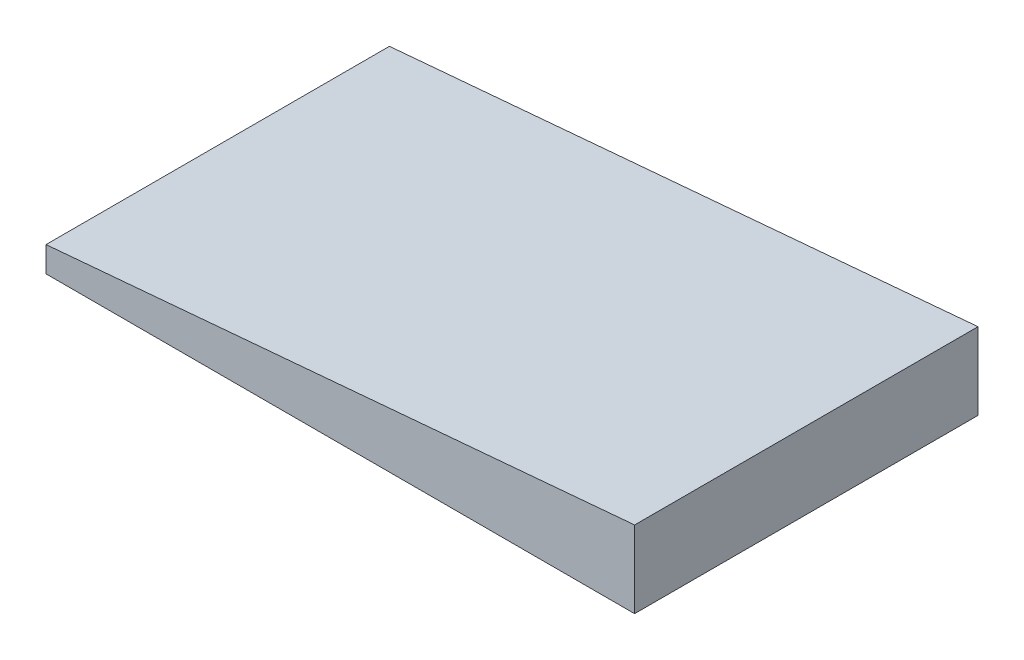
ISO-10303-21;
HEADER;
FILE_DESCRIPTION(('STEP AP214'),'2;1');
FILE_NAME('part.step','',(''),(''),'','','');
FILE_SCHEMA(('AUTOMOTIVE_DESIGN { 1 0 10303 214 1 1 1 1 }'));
ENDSEC;
DATA;
#1=APPLICATION_CONTEXT('core data for automotive mechanical design processes');
#2=APPLICATION_PROTOCOL_DEFINITION('international standard','automotive_design',2000,#1);
#3=PRODUCT_CONTEXT('',#1,'mechanical');
#4=PRODUCT('Part','Part','',(#3));
#5=PRODUCT_RELATED_PRODUCT_CATEGORY('part','',(#4));
#6=PRODUCT_DEFINITION_FORMATION('','',#4);
#7=PRODUCT_DEFINITION_CONTEXT('part definition',#1,'design');
#8=PRODUCT_DEFINITION('design','',#6,#7);
#9=PRODUCT_DEFINITION_SHAPE('','',#8);
#10=(LENGTH_UNIT() NAMED_UNIT(*) SI_UNIT(.MILLI.,.METRE.));
#11=(NAMED_UNIT(*) PLANE_ANGLE_UNIT() SI_UNIT($,.RADIAN.));
#12=(NAMED_UNIT(*) SI_UNIT($,.STERADIAN.) SOLID_ANGLE_UNIT());
#13=UNCERTAINTY_MEASURE_WITH_UNIT(LENGTH_MEASURE(1.E-05),#10,'distance_accuracy_value','');
#14=(GEOMETRIC_REPRESENTATION_CONTEXT(3) GLOBAL_UNCERTAINTY_ASSIGNED_CONTEXT((#13)) GLOBAL_UNIT_ASSIGNED_CONTEXT((#10,
#11,#12)) REPRESENTATION_CONTEXT('',''));
#15=CARTESIAN_POINT('',(0.,0.,0.));
#16=DIRECTION('',(0.,0.,1.));
#17=DIRECTION('',(1.,0.,0.));
#18=AXIS2_PLACEMENT_3D('',#15,#16,#17);
#19=CARTESIAN_POINT('',(1140.4,151.521845155475,338.5));
#20=DIRECTION('',(-1.,0.,0.));
#21=DIRECTION('',(0.,0.,1.));
#22=AXIS2_PLACEMENT_3D('',#19,#20,#21);
#23=PLANE('',#22);
#24=DIRECTION('',(0.,0.,-1.));
#25=VECTOR('',#24,1.);
#26=CARTESIAN_POINT('',(1140.4,0.,338.5));
#27=LINE('',#26,#25);
#28=CARTESIAN_POINT('',(1140.4,0.,-180.));
#29=VERTEX_POINT('',#28);
#30=CARTESIAN_POINT('',(1140.4,0.,-318.5));
#31=VERTEX_POINT('',#30);
#32=EDGE_CURVE('E223',#29,#31,#27,.T.);
#33=ORIENTED_EDGE('',*,*,#32,.F.);
#34=DIRECTION('',(0.,1.,0.));
#35=VECTOR('',#34,1.);
#36=CARTESIAN_POINT('',(1140.4,0.,-180.));
#37=LINE('',#36,#35);
#38=CARTESIAN_POINT('',(1140.4,129.695675134089,-180.));
#39=VERTEX_POINT('',#38);
#40=EDGE_CURVE('E54',#29,#39,#37,.T.);
#41=ORIENTED_EDGE('',*,*,#40,.T.);
#42=DIRECTION('',(0.,0.,-1.));
#43=VECTOR('',#42,1.);
#44=CARTESIAN_POINT('',(1140.4,129.695675134089,338.5));
#45=LINE('',#44,#43);
#46=CARTESIAN_POINT('',(1140.4,129.695675134089,-318.5));
#47=VERTEX_POINT('',#46);
#48=EDGE_CURVE('E208',#39,#47,#45,.T.);
#49=ORIENTED_EDGE('',*,*,#48,.T.);
#50=DIRECTION('',(0.,1.,0.));
#51=VECTOR('',#50,1.);
#52=CARTESIAN_POINT('',(1140.4,0.,-318.5));
#53=LINE('',#52,#51);
#54=EDGE_CURVE('E348',#31,#47,#53,.T.);
#55=ORIENTED_EDGE('',*,*,#54,.F.);
#56=EDGE_LOOP('',(#33,#41,#49,#55));
#57=FACE_BOUND('',#56,.T.);
#58=ADVANCED_FACE('F39',(#57),#23,.T.);
#59=CARTESIAN_POINT('',(1.74311485495303,30.0761060381651,338.5));
#60=DIRECTION('',(0.0871557427476517,-0.996194698091746,0.));
#61=DIRECTION('',(0.996194698091746,0.0871557427476517,0.));
#62=AXIS2_PLACEMENT_3D('',#59,#60,#61);
#63=PLANE('',#62);
#64=ORIENTED_EDGE('',*,*,#48,.F.);
#65=DIRECTION('',(-0.996194698091746,-0.0871557427476517,0.));
#66=VECTOR('',#65,1.);
#67=CARTESIAN_POINT('',(1140.4,129.695675134089,-180.));
#68=LINE('',#67,#66);
#69=CARTESIAN_POINT('',(20.,31.6733765196514,-180.));
#70=VERTEX_POINT('',#69);
#71=EDGE_CURVE('E494',#39,#70,#68,.T.);
#72=ORIENTED_EDGE('',*,*,#71,.T.);
#73=DIRECTION('',(0.,0.,-1.));
#74=VECTOR('',#73,1.);
#75=CARTESIAN_POINT('',(20.,31.6733765196514,338.5));
#76=LINE('',#75,#74);
#77=CARTESIAN_POINT('',(20.,31.6733765196514,-318.5));
#78=VERTEX_POINT('',#77);
#79=EDGE_CURVE('E201',#70,#78,#76,.T.);
#80=ORIENTED_EDGE('',*,*,#79,.T.);
#81=DIRECTION('',(-0.996194698091746,-0.0871557427476517,0.));
#82=VECTOR('',#81,1.);
#83=CARTESIAN_POINT('',(-2.5980895867199,29.6962998634703,-318.5));
#84=LINE('',#83,#82);
#85=EDGE_CURVE('E349',#47,#78,#84,.T.);
#86=ORIENTED_EDGE('',*,*,#85,.F.);
#87=EDGE_LOOP('',(#64,#72,#80,#86));
#88=FACE_BOUND('',#87,.T.);
#89=ADVANCED_FACE('F301',(#88),#63,.T.);
#90=CARTESIAN_POINT('',(20.,0.,338.5));
#91=DIRECTION('',(1.,0.,0.));
#92=DIRECTION('',(0.,0.,-1.));
#93=AXIS2_PLACEMENT_3D('',#90,#91,#92);
#94=PLANE('',#93);
#95=ORIENTED_EDGE('',*,*,#79,.F.);
#96=DIRECTION('',(0.,-1.,0.));
#97=VECTOR('',#96,1.);
#98=CARTESIAN_POINT('',(20.,31.6733765196514,-180.));
#99=LINE('',#98,#97);
#100=CARTESIAN_POINT('',(20.,0.,-180.));
#101=VERTEX_POINT('',#100);
#102=EDGE_CURVE('E496',#70,#101,#99,.T.);
#103=ORIENTED_EDGE('',*,*,#102,.T.);
#104=DIRECTION('',(0.,0.,-1.));
#105=VECTOR('',#104,1.);
#106=CARTESIAN_POINT('',(20.,0.,338.5));
#107=LINE('',#106,#105);
#108=CARTESIAN_POINT('',(20.,0.,-318.5));
#109=VERTEX_POINT('',#108);
#110=EDGE_CURVE('E503',#101,#109,#107,.T.);
#111=ORIENTED_EDGE('',*,*,#110,.T.);
#112=DIRECTION('',(0.,-1.,0.));
#113=VECTOR('',#112,1.);
#114=CARTESIAN_POINT('',(20.,0.,-318.5));
#115=LINE('',#114,#113);
#116=EDGE_CURVE('E354',#78,#109,#115,.T.);
#117=ORIENTED_EDGE('',*,*,#116,.F.);
#118=EDGE_LOOP('',(#95,#103,#111,#117));
#119=FACE_BOUND('',#118,.T.);
#120=ADVANCED_FACE('F307',(#119),#94,.T.);
#121=CARTESIAN_POINT('',(1140.4,0.,160.));
#122=VERTEX_POINT('',#121);
#123=CARTESIAN_POINT('',(1140.4,0.,10.));
#124=VERTEX_POINT('',#123);
#125=EDGE_CURVE('E229',#122,#124,#27,.T.);
#126=ORIENTED_EDGE('',*,*,#125,.F.);
#127=DIRECTION('',(0.,1.,0.));
#128=VECTOR('',#127,1.);
#129=CARTESIAN_POINT('',(1140.4,0.,160.));
#130=LINE('',#129,#128);
#131=CARTESIAN_POINT('',(1140.4,129.695675134089,160.));
#132=VERTEX_POINT('',#131);
#133=EDGE_CURVE('E380',#122,#132,#130,.T.);
#134=ORIENTED_EDGE('',*,*,#133,.T.);
#135=CARTESIAN_POINT('',(1140.4,129.695675134089,10.));
#136=VERTEX_POINT('',#135);
#137=EDGE_CURVE('E214',#132,#136,#45,.T.);
#138=ORIENTED_EDGE('',*,*,#137,.T.);
#139=DIRECTION('',(0.,1.,0.));
#140=VECTOR('',#139,1.);
#141=CARTESIAN_POINT('',(1140.4,0.,10.));
#142=LINE('',#141,#140);
#143=EDGE_CURVE('E355',#124,#136,#142,.T.);
#144=ORIENTED_EDGE('',*,*,#143,.F.);
#145=EDGE_LOOP('',(#126,#134,#138,#144));
#146=FACE_BOUND('',#145,.T.);
#147=ADVANCED_FACE('F303',(#146),#23,.T.);
#148=ORIENTED_EDGE('',*,*,#137,.F.);
#149=DIRECTION('',(-0.996194698091746,-0.0871557427476517,0.));
#150=VECTOR('',#149,1.);
#151=CARTESIAN_POINT('',(1140.4,129.695675134089,160.));
#152=LINE('',#151,#150);
#153=CARTESIAN_POINT('',(20.,31.6733765196514,160.));
#154=VERTEX_POINT('',#153);
#155=EDGE_CURVE('E332',#132,#154,#152,.T.);
#156=ORIENTED_EDGE('',*,*,#155,.T.);
#157=CARTESIAN_POINT('',(20.,31.6733765196514,10.));
#158=VERTEX_POINT('',#157);
#159=EDGE_CURVE('E200',#154,#158,#76,.T.);
#160=ORIENTED_EDGE('',*,*,#159,.T.);
#161=DIRECTION('',(-0.996194698091746,-0.0871557427476517,0.));
#162=VECTOR('',#161,1.);
#163=CARTESIAN_POINT('',(1140.4,129.695675134089,10.));
#164=LINE('',#163,#162);
#165=EDGE_CURVE('E342',#136,#158,#164,.T.);
#166=ORIENTED_EDGE('',*,*,#165,.F.);
#167=EDGE_LOOP('',(#148,#156,#160,#166));
#168=FACE_BOUND('',#167,.T.);
#169=ADVANCED_FACE('F310',(#168),#63,.T.);
#170=ORIENTED_EDGE('',*,*,#159,.F.);
#171=DIRECTION('',(0.,-1.,0.));
#172=VECTOR('',#171,1.);
#173=CARTESIAN_POINT('',(20.,31.6733765196514,160.));
#174=LINE('',#173,#172);
#175=CARTESIAN_POINT('',(20.,0.,160.));
#176=VERTEX_POINT('',#175);
#177=EDGE_CURVE('E377',#154,#176,#174,.T.);
#178=ORIENTED_EDGE('',*,*,#177,.T.);
#179=CARTESIAN_POINT('',(20.,0.,10.));
#180=VERTEX_POINT('',#179);
#181=EDGE_CURVE('E390',#176,#180,#107,.T.);
#182=ORIENTED_EDGE('',*,*,#181,.T.);
#183=DIRECTION('',(0.,-1.,0.));
#184=VECTOR('',#183,1.);
#185=CARTESIAN_POINT('',(20.,31.6733765196514,10.));
#186=LINE('',#185,#184);
#187=EDGE_CURVE('E345',#158,#180,#186,.T.);
#188=ORIENTED_EDGE('',*,*,#187,.F.);
#189=EDGE_LOOP('',(#170,#178,#182,#188));
#190=FACE_BOUND('',#189,.T.);
#191=ADVANCED_FACE('F322',(#190),#94,.T.);
#192=DIRECTION('',(0.,1.,0.));
#193=VECTOR('',#192,1.);
#194=CARTESIAN_POINT('',(1140.4,0.,-160.));
#195=LINE('',#194,#193);
#196=CARTESIAN_POINT('',(1140.4,0.,-160.));
#197=VERTEX_POINT('',#196);
#198=CARTESIAN_POINT('',(1140.4,129.695675134089,-160.));
#199=VERTEX_POINT('',#198);
#200=EDGE_CURVE('E181',#197,#199,#195,.T.);
#201=ORIENTED_EDGE('',*,*,#200,.F.);
#202=CARTESIAN_POINT('',(1140.4,0.,-10.));
#203=VERTEX_POINT('',#202);
#204=EDGE_CURVE('E227',#203,#197,#27,.T.);
#205=ORIENTED_EDGE('',*,*,#204,.F.);
#206=DIRECTION('',(0.,1.,0.));
#207=VECTOR('',#206,1.);
#208=CARTESIAN_POINT('',(1140.4,0.,-10.));
#209=LINE('',#208,#207);
#210=CARTESIAN_POINT('',(1140.4,129.695675134089,-10.));
#211=VERTEX_POINT('',#210);
#212=EDGE_CURVE('E338',#203,#211,#209,.T.);
#213=ORIENTED_EDGE('',*,*,#212,.T.);
#214=EDGE_CURVE('E212',#211,#199,#45,.T.);
#215=ORIENTED_EDGE('',*,*,#214,.T.);
#216=EDGE_LOOP('',(#201,#205,#213,#215));
#217=FACE_BOUND('',#216,.T.);
#218=ADVANCED_FACE('F315',(#217),#23,.T.);
#219=DIRECTION('',(-0.996194698091746,-0.0871557427476517,0.));
#220=VECTOR('',#219,1.);
#221=CARTESIAN_POINT('',(1140.4,129.695675134089,-160.));
#222=LINE('',#221,#220);
#223=CARTESIAN_POINT('',(20.,31.6733765196514,-160.));
#224=VERTEX_POINT('',#223);
#225=EDGE_CURVE('E175',#199,#224,#222,.T.);
#226=ORIENTED_EDGE('',*,*,#225,.F.);
#227=ORIENTED_EDGE('',*,*,#214,.F.);
#228=DIRECTION('',(-0.996194698091746,-0.0871557427476517,0.));
#229=VECTOR('',#228,1.);
#230=CARTESIAN_POINT('',(1140.4,129.695675134089,-10.));
#231=LINE('',#230,#229);
#232=CARTESIAN_POINT('',(20.,31.6733765196514,-10.));
#233=VERTEX_POINT('',#232);
#234=EDGE_CURVE('E199',#211,#233,#231,.T.);
#235=ORIENTED_EDGE('',*,*,#234,.T.);
#236=EDGE_CURVE('E192',#233,#224,#76,.T.);
#237=ORIENTED_EDGE('',*,*,#236,.T.);
#238=EDGE_LOOP('',(#226,#227,#235,#237));
#239=FACE_BOUND('',#238,.T.);
#240=ADVANCED_FACE('F198',(#239),#63,.T.);
#241=DIRECTION('',(0.,-1.,0.));
#242=VECTOR('',#241,1.);
#243=CARTESIAN_POINT('',(20.,31.6733765196514,-160.));
#244=LINE('',#243,#242);
#245=CARTESIAN_POINT('',(20.,0.,-160.));
#246=VERTEX_POINT('',#245);
#247=EDGE_CURVE('E178',#224,#246,#244,.T.);
#248=ORIENTED_EDGE('',*,*,#247,.F.);
#249=ORIENTED_EDGE('',*,*,#236,.F.);
#250=DIRECTION('',(0.,-1.,0.));
#251=VECTOR('',#250,1.);
#252=CARTESIAN_POINT('',(20.,31.6733765196514,-10.));
#253=LINE('',#252,#251);
#254=CARTESIAN_POINT('',(20.,0.,-10.));
#255=VERTEX_POINT('',#254);
#256=EDGE_CURVE('E339',#233,#255,#253,.T.);
#257=ORIENTED_EDGE('',*,*,#256,.T.);
#258=EDGE_CURVE('E194',#255,#246,#107,.T.);
#259=ORIENTED_EDGE('',*,*,#258,.T.);
#260=EDGE_LOOP('',(#248,#249,#257,#259));
#261=FACE_BOUND('',#260,.T.);
#262=ADVANCED_FACE('F190',(#261),#94,.T.);
#263=CARTESIAN_POINT('',(1160.4,0.,338.5));
#264=DIRECTION('',(0.,1.,0.));
#265=DIRECTION('',(-1.,0.,0.));
#266=AXIS2_PLACEMENT_3D('',#263,#264,#265);
#267=PLANE('',#266);
#268=ORIENTED_EDGE('',*,*,#110,.F.);
#269=DIRECTION('',(1.,0.,0.));
#270=VECTOR('',#269,1.);
#271=CARTESIAN_POINT('',(20.,0.,-180.));
#272=LINE('',#271,#270);
#273=EDGE_CURVE('E499',#101,#29,#272,.T.);
#274=ORIENTED_EDGE('',*,*,#273,.T.);
#275=ORIENTED_EDGE('',*,*,#32,.T.);
#276=DIRECTION('',(1.,0.,0.));
#277=VECTOR('',#276,1.);
#278=CARTESIAN_POINT('',(0.,0.,-318.5));
#279=LINE('',#278,#277);
#280=EDGE_CURVE('E287',#109,#31,#279,.T.);
#281=ORIENTED_EDGE('',*,*,#280,.F.);
#282=EDGE_LOOP('',(#268,#274,#275,#281));
#283=FACE_BOUND('',#282,.T.);
#284=DIRECTION('',(1.,0.,0.));
#285=VECTOR('',#284,1.);
#286=CARTESIAN_POINT('',(20.,0.,160.));
#287=LINE('',#286,#285);
#288=EDGE_CURVE('E62',#176,#122,#287,.T.);
#289=ORIENTED_EDGE('',*,*,#288,.T.);
#290=ORIENTED_EDGE('',*,*,#125,.T.);
#291=DIRECTION('',(1.,0.,0.));
#292=VECTOR('',#291,1.);
#293=CARTESIAN_POINT('',(20.,0.,10.));
#294=LINE('',#293,#292);
#295=EDGE_CURVE('E358',#180,#124,#294,.T.);
#296=ORIENTED_EDGE('',*,*,#295,.F.);
#297=ORIENTED_EDGE('',*,*,#181,.F.);
#298=EDGE_LOOP('',(#289,#290,#296,#297));
#299=FACE_BOUND('',#298,.T.);
#300=DIRECTION('',(1.,0.,0.));
#301=VECTOR('',#300,1.);
#302=CARTESIAN_POINT('',(20.,0.,-10.));
#303=LINE('',#302,#301);
#304=EDGE_CURVE('E335',#255,#203,#303,.T.);
#305=ORIENTED_EDGE('',*,*,#304,.T.);
#306=ORIENTED_EDGE('',*,*,#204,.T.);
#307=DIRECTION('',(1.,0.,0.));
#308=VECTOR('',#307,1.);
#309=CARTESIAN_POINT('',(20.,0.,-160.));
#310=LINE('',#309,#308);
#311=EDGE_CURVE('E195',#246,#197,#310,.T.);
#312=ORIENTED_EDGE('',*,*,#311,.F.);
#313=ORIENTED_EDGE('',*,*,#258,.F.);
#314=EDGE_LOOP('',(#305,#306,#312,#313));
#315=FACE_BOUND('',#314,.T.);
#316=DIRECTION('',(1.,0.,0.));
#317=VECTOR('',#316,1.);
#318=CARTESIAN_POINT('',(1160.4,0.,-338.5));
#319=LINE('',#318,#317);
#320=CARTESIAN_POINT('',(0.,0.,-338.5));
#321=VERTEX_POINT('',#320);
#322=CARTESIAN_POINT('',(1160.4,0.,-338.5));
#323=VERTEX_POINT('',#322);
#324=EDGE_CURVE('E238',#321,#323,#319,.T.);
#325=ORIENTED_EDGE('',*,*,#324,.T.);
#326=DIRECTION('',(0.,0.,-1.));
#327=VECTOR('',#326,1.);
#328=CARTESIAN_POINT('',(1160.4,0.,338.5));
#329=LINE('',#328,#327);
#330=CARTESIAN_POINT('',(1160.4,0.,338.5));
#331=VERTEX_POINT('',#330);
#332=EDGE_CURVE('E11',#331,#323,#329,.T.);
#333=ORIENTED_EDGE('',*,*,#332,.F.);
#334=DIRECTION('',(1.,0.,0.));
#335=VECTOR('',#334,1.);
#336=CARTESIAN_POINT('',(1160.4,0.,338.5));
#337=LINE('',#336,#335);
#338=CARTESIAN_POINT('',(0.,0.,338.5));
#339=VERTEX_POINT('',#338);
#340=EDGE_CURVE('E259',#339,#331,#337,.T.);
#341=ORIENTED_EDGE('',*,*,#340,.F.);
#342=DIRECTION('',(0.,0.,-1.));
#343=VECTOR('',#342,1.);
#344=CARTESIAN_POINT('',(0.,0.,338.5));
#345=LINE('',#344,#343);
#346=EDGE_CURVE('E260',#339,#321,#345,.T.);
#347=ORIENTED_EDGE('',*,*,#346,.T.);
#348=EDGE_LOOP('',(#325,#333,#341,#347));
#349=FACE_BOUND('',#348,.T.);
#350=CARTESIAN_POINT('',(1140.4,0.,318.5));
#351=VERTEX_POINT('',#350);
#352=CARTESIAN_POINT('',(1140.4,0.,180.));
#353=VERTEX_POINT('',#352);
#354=EDGE_CURVE('E230',#351,#353,#27,.T.);
#355=ORIENTED_EDGE('',*,*,#354,.T.);
#356=DIRECTION('',(1.,0.,0.));
#357=VECTOR('',#356,1.);
#358=CARTESIAN_POINT('',(20.,0.,180.));
#359=LINE('',#358,#357);
#360=CARTESIAN_POINT('',(20.,0.,180.));
#361=VERTEX_POINT('',#360);
#362=EDGE_CURVE('E368',#361,#353,#359,.T.);
#363=ORIENTED_EDGE('',*,*,#362,.F.);
#364=CARTESIAN_POINT('',(20.,0.,318.5));
#365=VERTEX_POINT('',#364);
#366=EDGE_CURVE('E204',#365,#361,#107,.T.);
#367=ORIENTED_EDGE('',*,*,#366,.F.);
#368=DIRECTION('',(1.,0.,0.));
#369=VECTOR('',#368,1.);
#370=CARTESIAN_POINT('',(0.,0.,318.5));
#371=LINE('',#370,#369);
#372=EDGE_CURVE('E504',#365,#351,#371,.T.);
#373=ORIENTED_EDGE('',*,*,#372,.T.);
#374=EDGE_LOOP('',(#355,#363,#367,#373));
#375=FACE_BOUND('',#374,.T.);
#376=ADVANCED_FACE('F41',(#283,#299,#315,#349,#375),#267,.F.);
#377=CARTESIAN_POINT('',(1160.4,151.521845155475,338.5));
#378=DIRECTION('',(-1.,0.,0.));
#379=DIRECTION('',(0.,0.,1.));
#380=AXIS2_PLACEMENT_3D('',#377,#378,#379);
#381=PLANE('',#380);
#382=DIRECTION('',(0.,1.,0.));
#383=VECTOR('',#382,1.);
#384=CARTESIAN_POINT('',(1160.4,151.521845155475,-338.5));
#385=LINE('',#384,#383);
#386=CARTESIAN_POINT('',(1160.4,151.521845155475,-338.5));
#387=VERTEX_POINT('',#386);
#388=EDGE_CURVE('E244',#323,#387,#385,.T.);
#389=ORIENTED_EDGE('',*,*,#388,.T.);
#390=DIRECTION('',(0.,0.,-1.));
#391=VECTOR('',#390,1.);
#392=CARTESIAN_POINT('',(1160.4,151.521845155475,338.5));
#393=LINE('',#392,#391);
#394=CARTESIAN_POINT('',(1160.4,151.521845155475,338.5));
#395=VERTEX_POINT('',#394);
#396=EDGE_CURVE('E47',#395,#387,#393,.T.);
#397=ORIENTED_EDGE('',*,*,#396,.F.);
#398=DIRECTION('',(0.,1.,0.));
#399=VECTOR('',#398,1.);
#400=CARTESIAN_POINT('',(1160.4,151.521845155475,338.5));
#401=LINE('',#400,#399);
#402=EDGE_CURVE('E283',#331,#395,#401,.T.);
#403=ORIENTED_EDGE('',*,*,#402,.F.);
#404=ORIENTED_EDGE('',*,*,#332,.T.);
#405=EDGE_LOOP('',(#389,#397,#403,#404));
#406=FACE_BOUND('',#405,.T.);
#407=ADVANCED_FACE('F476',(#406),#381,.F.);
#408=CARTESIAN_POINT('',(0.,50.,338.5));
#409=DIRECTION('',(0.0871557427476517,-0.996194698091746,0.));
#410=DIRECTION('',(0.996194698091746,0.0871557427476517,0.));
#411=AXIS2_PLACEMENT_3D('',#408,#409,#410);
#412=PLANE('',#411);
#413=DIRECTION('',(-0.996194698091746,-0.0871557427476517,0.));
#414=VECTOR('',#413,1.);
#415=CARTESIAN_POINT('',(0.,50.,-338.5));
#416=LINE('',#415,#414);
#417=CARTESIAN_POINT('',(0.,50.,-338.5));
#418=VERTEX_POINT('',#417);
#419=EDGE_CURVE('E250',#387,#418,#416,.T.);
#420=ORIENTED_EDGE('',*,*,#419,.T.);
#421=DIRECTION('',(0.,0.,-1.));
#422=VECTOR('',#421,1.);
#423=CARTESIAN_POINT('',(0.,50.,338.5));
#424=LINE('',#423,#422);
#425=CARTESIAN_POINT('',(0.,50.,338.5));
#426=VERTEX_POINT('',#425);
#427=EDGE_CURVE('E262',#426,#418,#424,.T.);
#428=ORIENTED_EDGE('',*,*,#427,.F.);
#429=DIRECTION('',(-0.996194698091746,-0.0871557427476517,0.));
#430=VECTOR('',#429,1.);
#431=CARTESIAN_POINT('',(0.,50.,338.5));
#432=LINE('',#431,#430);
#433=EDGE_CURVE('E271',#395,#426,#432,.T.);
#434=ORIENTED_EDGE('',*,*,#433,.F.);
#435=ORIENTED_EDGE('',*,*,#396,.T.);
#436=EDGE_LOOP('',(#420,#428,#434,#435));
#437=FACE_BOUND('',#436,.T.);
#438=ADVANCED_FACE('F269',(#437),#412,.F.);
#439=CARTESIAN_POINT('',(0.,0.,338.5));
#440=DIRECTION('',(1.,0.,0.));
#441=DIRECTION('',(0.,0.,-1.));
#442=AXIS2_PLACEMENT_3D('',#439,#440,#441);
#443=PLANE('',#442);
#444=DIRECTION('',(0.,-1.,0.));
#445=VECTOR('',#444,1.);
#446=CARTESIAN_POINT('',(0.,0.,-338.5));
#447=LINE('',#446,#445);
#448=EDGE_CURVE('E257',#418,#321,#447,.T.);
#449=ORIENTED_EDGE('',*,*,#448,.T.);
#450=ORIENTED_EDGE('',*,*,#346,.F.);
#451=DIRECTION('',(0.,-1.,0.));
#452=VECTOR('',#451,1.);
#453=CARTESIAN_POINT('',(0.,0.,338.5));
#454=LINE('',#453,#452);
#455=EDGE_CURVE('E253',#426,#339,#454,.T.);
#456=ORIENTED_EDGE('',*,*,#455,.F.);
#457=ORIENTED_EDGE('',*,*,#427,.T.);
#458=EDGE_LOOP('',(#449,#450,#456,#457));
#459=FACE_BOUND('',#458,.T.);
#460=ADVANCED_FACE('F278',(#459),#443,.F.);
#461=CARTESIAN_POINT('',(0.,0.,338.5));
#462=DIRECTION('',(0.,0.,-1.));
#463=DIRECTION('',(-1.,0.,0.));
#464=AXIS2_PLACEMENT_3D('',#461,#462,#463);
#465=PLANE('',#464);
#466=ORIENTED_EDGE('',*,*,#340,.T.);
#467=ORIENTED_EDGE('',*,*,#402,.T.);
#468=ORIENTED_EDGE('',*,*,#433,.T.);
#469=ORIENTED_EDGE('',*,*,#455,.T.);
#470=EDGE_LOOP('',(#466,#467,#468,#469));
#471=FACE_BOUND('',#470,.T.);
#472=ADVANCED_FACE('F289',(#471),#465,.F.);
#473=CARTESIAN_POINT('',(0.,0.,-338.5));
#474=DIRECTION('',(0.,0.,-1.));
#475=DIRECTION('',(-1.,0.,0.));
#476=AXIS2_PLACEMENT_3D('',#473,#474,#475);
#477=PLANE('',#476);
#478=ORIENTED_EDGE('',*,*,#324,.F.);
#479=ORIENTED_EDGE('',*,*,#448,.F.);
#480=ORIENTED_EDGE('',*,*,#419,.F.);
#481=ORIENTED_EDGE('',*,*,#388,.F.);
#482=EDGE_LOOP('',(#478,#479,#480,#481));
#483=FACE_BOUND('',#482,.T.);
#484=ADVANCED_FACE('F275',(#483),#477,.T.);
#485=DIRECTION('',(0.,1.,0.));
#486=VECTOR('',#485,1.);
#487=CARTESIAN_POINT('',(1140.4,0.,180.));
#488=LINE('',#487,#486);
#489=CARTESIAN_POINT('',(1140.4,129.695675134089,180.));
#490=VERTEX_POINT('',#489);
#491=EDGE_CURVE('E367',#353,#490,#488,.T.);
#492=ORIENTED_EDGE('',*,*,#491,.F.);
#493=ORIENTED_EDGE('',*,*,#354,.F.);
#494=DIRECTION('',(0.,1.,0.));
#495=VECTOR('',#494,1.);
#496=CARTESIAN_POINT('',(1140.4,0.,318.5));
#497=LINE('',#496,#495);
#498=CARTESIAN_POINT('',(1140.4,129.695675134089,318.5));
#499=VERTEX_POINT('',#498);
#500=EDGE_CURVE('E506',#351,#499,#497,.T.);
#501=ORIENTED_EDGE('',*,*,#500,.T.);
#502=EDGE_CURVE('E215',#499,#490,#45,.T.);
#503=ORIENTED_EDGE('',*,*,#502,.T.);
#504=EDGE_LOOP('',(#492,#493,#501,#503));
#505=FACE_BOUND('',#504,.T.);
#506=ADVANCED_FACE('F296',(#505),#23,.T.);
#507=DIRECTION('',(-0.996194698091746,-0.0871557427476517,0.));
#508=VECTOR('',#507,1.);
#509=CARTESIAN_POINT('',(1140.4,129.695675134089,180.));
#510=LINE('',#509,#508);
#511=CARTESIAN_POINT('',(20.,31.6733765196514,180.));
#512=VERTEX_POINT('',#511);
#513=EDGE_CURVE('E382',#490,#512,#510,.T.);
#514=ORIENTED_EDGE('',*,*,#513,.F.);
#515=ORIENTED_EDGE('',*,*,#502,.F.);
#516=DIRECTION('',(-0.996194698091746,-0.0871557427476517,0.));
#517=VECTOR('',#516,1.);
#518=CARTESIAN_POINT('',(-2.5980895867199,29.6962998634703,318.5));
#519=LINE('',#518,#517);
#520=CARTESIAN_POINT('',(20.,31.6733765196514,318.5));
#521=VERTEX_POINT('',#520);
#522=EDGE_CURVE('E507',#499,#521,#519,.T.);
#523=ORIENTED_EDGE('',*,*,#522,.T.);
#524=EDGE_CURVE('E203',#521,#512,#76,.T.);
#525=ORIENTED_EDGE('',*,*,#524,.T.);
#526=EDGE_LOOP('',(#514,#515,#523,#525));
#527=FACE_BOUND('',#526,.T.);
#528=ADVANCED_FACE('F311',(#527),#63,.T.);
#529=DIRECTION('',(0.,-1.,0.));
#530=VECTOR('',#529,1.);
#531=CARTESIAN_POINT('',(20.,31.6733765196514,180.));
#532=LINE('',#531,#530);
#533=EDGE_CURVE('E371',#512,#361,#532,.T.);
#534=ORIENTED_EDGE('',*,*,#533,.F.);
#535=ORIENTED_EDGE('',*,*,#524,.F.);
#536=DIRECTION('',(0.,-1.,0.));
#537=VECTOR('',#536,1.);
#538=CARTESIAN_POINT('',(20.,0.,318.5));
#539=LINE('',#538,#537);
#540=EDGE_CURVE('E508',#521,#365,#539,.T.);
#541=ORIENTED_EDGE('',*,*,#540,.T.);
#542=ORIENTED_EDGE('',*,*,#366,.T.);
#543=EDGE_LOOP('',(#534,#535,#541,#542));
#544=FACE_BOUND('',#543,.T.);
#545=ADVANCED_FACE('F320',(#544),#94,.T.);
#546=CARTESIAN_POINT('',(0.,0.,318.5));
#547=DIRECTION('',(0.,0.,-1.));
#548=DIRECTION('',(-1.,0.,0.));
#549=AXIS2_PLACEMENT_3D('',#546,#547,#548);
#550=PLANE('',#549);
#551=ORIENTED_EDGE('',*,*,#372,.F.);
#552=ORIENTED_EDGE('',*,*,#540,.F.);
#553=ORIENTED_EDGE('',*,*,#522,.F.);
#554=ORIENTED_EDGE('',*,*,#500,.F.);
#555=EDGE_LOOP('',(#551,#552,#553,#554));
#556=FACE_BOUND('',#555,.T.);
#557=ADVANCED_FACE('F516',(#556),#550,.T.);
#558=CARTESIAN_POINT('',(0.,0.,-318.5));
#559=DIRECTION('',(0.,0.,-1.));
#560=DIRECTION('',(-1.,0.,0.));
#561=AXIS2_PLACEMENT_3D('',#558,#559,#560);
#562=PLANE('',#561);
#563=ORIENTED_EDGE('',*,*,#280,.T.);
#564=ORIENTED_EDGE('',*,*,#54,.T.);
#565=ORIENTED_EDGE('',*,*,#85,.T.);
#566=ORIENTED_EDGE('',*,*,#116,.T.);
#567=EDGE_LOOP('',(#563,#564,#565,#566));
#568=FACE_BOUND('',#567,.T.);
#569=ADVANCED_FACE('F408',(#568),#562,.F.);
#570=CARTESIAN_POINT('',(0.,0.,10.));
#571=DIRECTION('',(0.,0.,1.));
#572=DIRECTION('',(1.,0.,0.));
#573=AXIS2_PLACEMENT_3D('',#570,#571,#572);
#574=PLANE('',#573);
#575=ORIENTED_EDGE('',*,*,#165,.T.);
#576=ORIENTED_EDGE('',*,*,#187,.T.);
#577=ORIENTED_EDGE('',*,*,#295,.T.);
#578=ORIENTED_EDGE('',*,*,#143,.T.);
#579=EDGE_LOOP('',(#575,#576,#577,#578));
#580=FACE_BOUND('',#579,.T.);
#581=ADVANCED_FACE('F386',(#580),#574,.T.);
#582=CARTESIAN_POINT('',(0.,0.,-10.));
#583=DIRECTION('',(0.,0.,1.));
#584=DIRECTION('',(1.,0.,0.));
#585=AXIS2_PLACEMENT_3D('',#582,#583,#584);
#586=PLANE('',#585);
#587=ORIENTED_EDGE('',*,*,#234,.F.);
#588=ORIENTED_EDGE('',*,*,#212,.F.);
#589=ORIENTED_EDGE('',*,*,#304,.F.);
#590=ORIENTED_EDGE('',*,*,#256,.F.);
#591=EDGE_LOOP('',(#587,#588,#589,#590));
#592=FACE_BOUND('',#591,.T.);
#593=ADVANCED_FACE('F341',(#592),#586,.F.);
#594=CARTESIAN_POINT('',(0.,0.,180.));
#595=DIRECTION('',(0.,0.,1.));
#596=DIRECTION('',(1.,0.,0.));
#597=AXIS2_PLACEMENT_3D('',#594,#595,#596);
#598=PLANE('',#597);
#599=ORIENTED_EDGE('',*,*,#513,.T.);
#600=ORIENTED_EDGE('',*,*,#533,.T.);
#601=ORIENTED_EDGE('',*,*,#362,.T.);
#602=ORIENTED_EDGE('',*,*,#491,.T.);
#603=EDGE_LOOP('',(#599,#600,#601,#602));
#604=FACE_BOUND('',#603,.T.);
#605=ADVANCED_FACE('F396',(#604),#598,.T.);
#606=CARTESIAN_POINT('',(0.,0.,160.));
#607=DIRECTION('',(0.,0.,1.));
#608=DIRECTION('',(1.,0.,0.));
#609=AXIS2_PLACEMENT_3D('',#606,#607,#608);
#610=PLANE('',#609);
#611=ORIENTED_EDGE('',*,*,#155,.F.);
#612=ORIENTED_EDGE('',*,*,#133,.F.);
#613=ORIENTED_EDGE('',*,*,#288,.F.);
#614=ORIENTED_EDGE('',*,*,#177,.F.);
#615=EDGE_LOOP('',(#611,#612,#613,#614));
#616=FACE_BOUND('',#615,.T.);
#617=ADVANCED_FACE('F394',(#616),#610,.F.);
#618=CARTESIAN_POINT('',(0.,0.,-160.));
#619=DIRECTION('',(0.,0.,1.));
#620=DIRECTION('',(1.,0.,0.));
#621=AXIS2_PLACEMENT_3D('',#618,#619,#620);
#622=PLANE('',#621);
#623=ORIENTED_EDGE('',*,*,#225,.T.);
#624=ORIENTED_EDGE('',*,*,#247,.T.);
#625=ORIENTED_EDGE('',*,*,#311,.T.);
#626=ORIENTED_EDGE('',*,*,#200,.T.);
#627=EDGE_LOOP('',(#623,#624,#625,#626));
#628=FACE_BOUND('',#627,.T.);
#629=ADVANCED_FACE('F177',(#628),#622,.T.);
#630=CARTESIAN_POINT('',(0.,0.,-180.));
#631=DIRECTION('',(0.,0.,1.));
#632=DIRECTION('',(1.,0.,0.));
#633=AXIS2_PLACEMENT_3D('',#630,#631,#632);
#634=PLANE('',#633);
#635=ORIENTED_EDGE('',*,*,#71,.F.);
#636=ORIENTED_EDGE('',*,*,#40,.F.);
#637=ORIENTED_EDGE('',*,*,#273,.F.);
#638=ORIENTED_EDGE('',*,*,#102,.F.);
#639=EDGE_LOOP('',(#635,#636,#637,#638));
#640=FACE_BOUND('',#639,.T.);
#641=ADVANCED_FACE('F402',(#640),#634,.F.);
#642=CLOSED_SHELL('',(#58,#89,#120,#147,#169,#191,#218,#240,#262,#376,#407,#438,#460,#472,#484,
#506,#528,#545,#557,#569,#581,#593,#605,#617,#629,#641));
#643=MANIFOLD_SOLID_BREP('B2',#642);
#644=ADVANCED_BREP_SHAPE_REPRESENTATION('',(#18,#643),#14);
#645=SHAPE_DEFINITION_REPRESENTATION(#9,#644);
ENDSEC;
END-ISO-10303-21;
